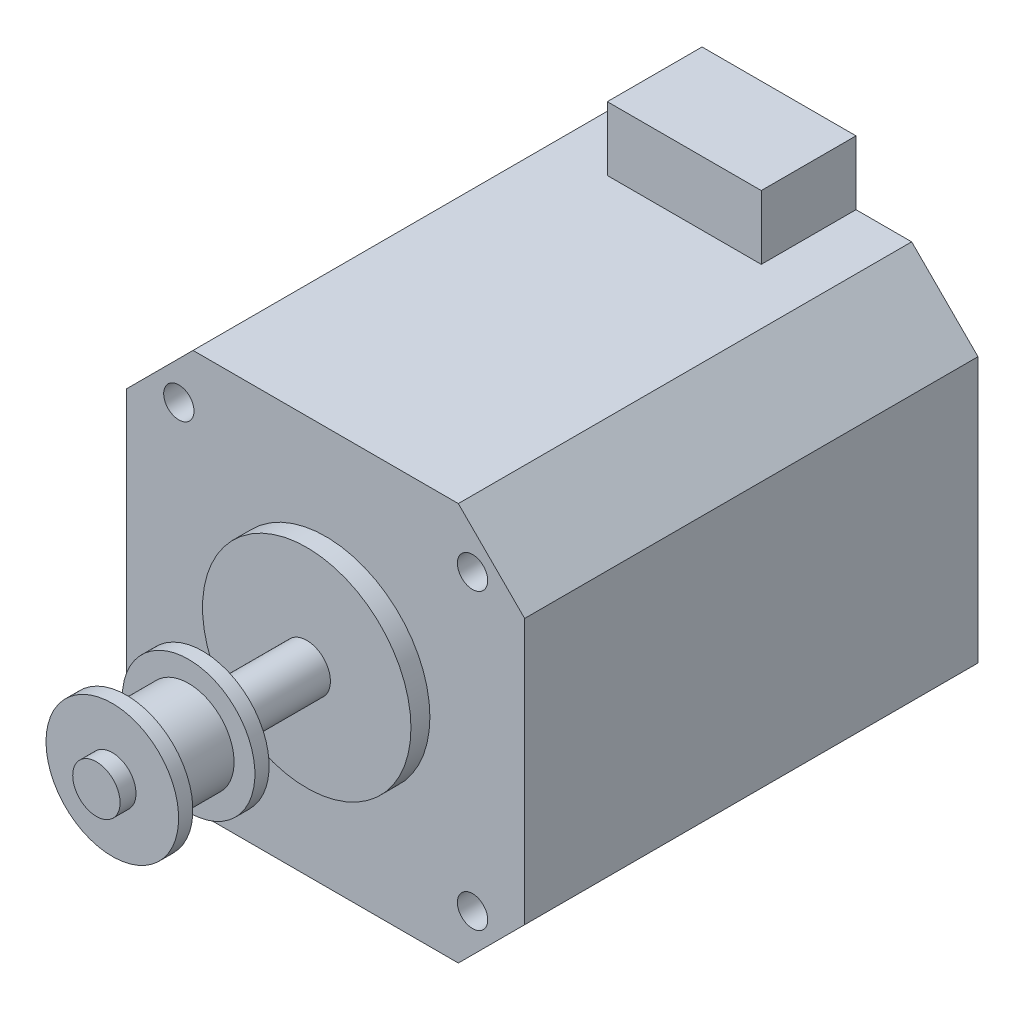
ISO-10303-21;
HEADER;
FILE_DESCRIPTION(('STEP AP214'),'2;1');
FILE_NAME('part.step','',(''),(''),'','','');
FILE_SCHEMA(('AUTOMOTIVE_DESIGN { 1 0 10303 214 1 1 1 1 }'));
ENDSEC;
DATA;
#1=APPLICATION_CONTEXT('core data for automotive mechanical design processes');
#2=APPLICATION_PROTOCOL_DEFINITION('international standard','automotive_design',2000,#1);
#3=PRODUCT_CONTEXT('',#1,'mechanical');
#4=PRODUCT('Part','Part','',(#3));
#5=PRODUCT_RELATED_PRODUCT_CATEGORY('part','',(#4));
#6=PRODUCT_DEFINITION_FORMATION('','',#4);
#7=PRODUCT_DEFINITION_CONTEXT('part definition',#1,'design');
#8=PRODUCT_DEFINITION('design','',#6,#7);
#9=PRODUCT_DEFINITION_SHAPE('','',#8);
#10=(LENGTH_UNIT() NAMED_UNIT(*) SI_UNIT(.MILLI.,.METRE.));
#11=(NAMED_UNIT(*) PLANE_ANGLE_UNIT() SI_UNIT($,.RADIAN.));
#12=(NAMED_UNIT(*) SI_UNIT($,.STERADIAN.) SOLID_ANGLE_UNIT());
#13=UNCERTAINTY_MEASURE_WITH_UNIT(LENGTH_MEASURE(1.E-05),#10,'distance_accuracy_value','');
#14=(GEOMETRIC_REPRESENTATION_CONTEXT(3) GLOBAL_UNCERTAINTY_ASSIGNED_CONTEXT((#13)) GLOBAL_UNIT_ASSIGNED_CONTEXT((#10,
#11,#12)) REPRESENTATION_CONTEXT('',''));
#15=CARTESIAN_POINT('',(0.,0.,0.));
#16=DIRECTION('',(0.,0.,1.));
#17=DIRECTION('',(1.,0.,0.));
#18=AXIS2_PLACEMENT_3D('',#15,#16,#17);
#19=CARTESIAN_POINT('',(0.,42.,47.85));
#20=DIRECTION('',(0.,-1.,0.));
#21=DIRECTION('',(0.,0.,-1.));
#22=AXIS2_PLACEMENT_3D('',#19,#20,#21);
#23=PLANE('',#22);
#24=DIRECTION('',(0.,0.,-1.));
#25=VECTOR('',#24,1.);
#26=CARTESIAN_POINT('',(29.125,42.,10.));
#27=LINE('',#26,#25);
#28=CARTESIAN_POINT('',(29.125,42.,10.));
#29=VERTEX_POINT('',#28);
#30=CARTESIAN_POINT('',(29.125,42.,0.));
#31=VERTEX_POINT('',#30);
#32=EDGE_CURVE('E146',#29,#31,#27,.T.);
#33=ORIENTED_EDGE('',*,*,#32,.F.);
#34=DIRECTION('',(-1.,0.,0.));
#35=VECTOR('',#34,1.);
#36=CARTESIAN_POINT('',(29.125,42.,10.));
#37=LINE('',#36,#35);
#38=CARTESIAN_POINT('',(12.875,42.,10.));
#39=VERTEX_POINT('',#38);
#40=EDGE_CURVE('E133',#29,#39,#37,.T.);
#41=ORIENTED_EDGE('',*,*,#40,.T.);
#42=DIRECTION('',(0.,0.,-1.));
#43=VECTOR('',#42,1.);
#44=CARTESIAN_POINT('',(12.875,42.,10.));
#45=LINE('',#44,#43);
#46=CARTESIAN_POINT('',(12.875,42.,0.));
#47=VERTEX_POINT('',#46);
#48=EDGE_CURVE('E155',#39,#47,#45,.T.);
#49=ORIENTED_EDGE('',*,*,#48,.T.);
#50=DIRECTION('',(-1.,0.,0.));
#51=VECTOR('',#50,1.);
#52=CARTESIAN_POINT('',(0.,42.,0.));
#53=LINE('',#52,#51);
#54=CARTESIAN_POINT('',(7.00000000000003,42.,0.));
#55=VERTEX_POINT('',#54);
#56=EDGE_CURVE('E187',#47,#55,#53,.T.);
#57=ORIENTED_EDGE('',*,*,#56,.T.);
#58=DIRECTION('',(0.,0.,1.));
#59=VECTOR('',#58,1.);
#60=CARTESIAN_POINT('',(7.00000000000003,42.,47.85));
#61=LINE('',#60,#59);
#62=CARTESIAN_POINT('',(7.00000000000003,42.,47.85));
#63=VERTEX_POINT('',#62);
#64=EDGE_CURVE('E65',#55,#63,#61,.T.);
#65=ORIENTED_EDGE('',*,*,#64,.T.);
#66=DIRECTION('',(-1.,0.,0.));
#67=VECTOR('',#66,1.);
#68=CARTESIAN_POINT('',(0.,42.,47.85));
#69=LINE('',#68,#67);
#70=CARTESIAN_POINT('',(35.,42.,47.85));
#71=VERTEX_POINT('',#70);
#72=EDGE_CURVE('E176',#71,#63,#69,.T.);
#73=ORIENTED_EDGE('',*,*,#72,.F.);
#74=DIRECTION('',(0.,0.,-1.));
#75=VECTOR('',#74,1.);
#76=CARTESIAN_POINT('',(35.,42.,47.85));
#77=LINE('',#76,#75);
#78=CARTESIAN_POINT('',(35.,42.,0.));
#79=VERTEX_POINT('',#78);
#80=EDGE_CURVE('E45',#71,#79,#77,.T.);
#81=ORIENTED_EDGE('',*,*,#80,.T.);
#82=EDGE_CURVE('E154',#79,#31,#53,.T.);
#83=ORIENTED_EDGE('',*,*,#82,.T.);
#84=EDGE_LOOP('',(#33,#41,#49,#57,#65,#73,#81,#83));
#85=FACE_BOUND('',#84,.T.);
#86=ADVANCED_FACE('F40',(#85),#23,.F.);
#87=CARTESIAN_POINT('',(0.,0.,47.85));
#88=DIRECTION('',(1.,0.,0.));
#89=DIRECTION('',(0.,0.,-1.));
#90=AXIS2_PLACEMENT_3D('',#87,#88,#89);
#91=PLANE('',#90);
#92=DIRECTION('',(0.,-1.,0.));
#93=VECTOR('',#92,1.);
#94=CARTESIAN_POINT('',(0.,0.,0.));
#95=LINE('',#94,#93);
#96=CARTESIAN_POINT('',(0.,35.,0.));
#97=VERTEX_POINT('',#96);
#98=CARTESIAN_POINT('',(0.,7.00000000000002,0.));
#99=VERTEX_POINT('',#98);
#100=EDGE_CURVE('E165',#97,#99,#95,.T.);
#101=ORIENTED_EDGE('',*,*,#100,.T.);
#102=DIRECTION('',(0.,0.,1.));
#103=VECTOR('',#102,1.);
#104=CARTESIAN_POINT('',(0.,7.00000000000003,47.85));
#105=LINE('',#104,#103);
#106=CARTESIAN_POINT('',(0.,7.00000000000002,47.85));
#107=VERTEX_POINT('',#106);
#108=EDGE_CURVE('E205',#99,#107,#105,.T.);
#109=ORIENTED_EDGE('',*,*,#108,.T.);
#110=DIRECTION('',(0.,-1.,0.));
#111=VECTOR('',#110,1.);
#112=CARTESIAN_POINT('',(0.,0.,47.85));
#113=LINE('',#112,#111);
#114=CARTESIAN_POINT('',(0.,35.,47.85));
#115=VERTEX_POINT('',#114);
#116=EDGE_CURVE('E167',#115,#107,#113,.T.);
#117=ORIENTED_EDGE('',*,*,#116,.F.);
#118=DIRECTION('',(0.,0.,-1.));
#119=VECTOR('',#118,1.);
#120=CARTESIAN_POINT('',(0.,35.,47.85));
#121=LINE('',#120,#119);
#122=EDGE_CURVE('E202',#115,#97,#121,.T.);
#123=ORIENTED_EDGE('',*,*,#122,.T.);
#124=EDGE_LOOP('',(#101,#109,#117,#123));
#125=FACE_BOUND('',#124,.T.);
#126=ADVANCED_FACE('F253',(#125),#91,.F.);
#127=CARTESIAN_POINT('',(0.,0.,47.85));
#128=DIRECTION('',(0.,1.,0.));
#129=DIRECTION('',(0.,0.,1.));
#130=AXIS2_PLACEMENT_3D('',#127,#128,#129);
#131=PLANE('',#130);
#132=DIRECTION('',(1.,0.,0.));
#133=VECTOR('',#132,1.);
#134=CARTESIAN_POINT('',(0.,0.,47.85));
#135=LINE('',#134,#133);
#136=CARTESIAN_POINT('',(7.,0.,47.85));
#137=VERTEX_POINT('',#136);
#138=CARTESIAN_POINT('',(35.,0.,47.85));
#139=VERTEX_POINT('',#138);
#140=EDGE_CURVE('E170',#137,#139,#135,.T.);
#141=ORIENTED_EDGE('',*,*,#140,.F.);
#142=DIRECTION('',(0.,0.,-1.));
#143=VECTOR('',#142,1.);
#144=CARTESIAN_POINT('',(7.,0.,47.85));
#145=LINE('',#144,#143);
#146=CARTESIAN_POINT('',(7.,0.,0.));
#147=VERTEX_POINT('',#146);
#148=EDGE_CURVE('E190',#137,#147,#145,.T.);
#149=ORIENTED_EDGE('',*,*,#148,.T.);
#150=DIRECTION('',(1.,0.,0.));
#151=VECTOR('',#150,1.);
#152=CARTESIAN_POINT('',(0.,0.,0.));
#153=LINE('',#152,#151);
#154=CARTESIAN_POINT('',(35.,0.,0.));
#155=VERTEX_POINT('',#154);
#156=EDGE_CURVE('E181',#147,#155,#153,.T.);
#157=ORIENTED_EDGE('',*,*,#156,.T.);
#158=DIRECTION('',(0.,0.,1.));
#159=VECTOR('',#158,1.);
#160=CARTESIAN_POINT('',(35.,0.,47.85));
#161=LINE('',#160,#159);
#162=EDGE_CURVE('E178',#155,#139,#161,.T.);
#163=ORIENTED_EDGE('',*,*,#162,.T.);
#164=EDGE_LOOP('',(#141,#149,#157,#163));
#165=FACE_BOUND('',#164,.T.);
#166=ADVANCED_FACE('F258',(#165),#131,.F.);
#167=CARTESIAN_POINT('',(42.,0.,47.85));
#168=DIRECTION('',(-1.,0.,0.));
#169=DIRECTION('',(0.,0.,1.));
#170=AXIS2_PLACEMENT_3D('',#167,#168,#169);
#171=PLANE('',#170);
#172=DIRECTION('',(0.,1.,0.));
#173=VECTOR('',#172,1.);
#174=CARTESIAN_POINT('',(42.,0.,47.85));
#175=LINE('',#174,#173);
#176=CARTESIAN_POINT('',(42.,7.,47.85));
#177=VERTEX_POINT('',#176);
#178=CARTESIAN_POINT('',(42.,35.,47.85));
#179=VERTEX_POINT('',#178);
#180=EDGE_CURVE('E173',#177,#179,#175,.T.);
#181=ORIENTED_EDGE('',*,*,#180,.F.);
#182=DIRECTION('',(0.,0.,-1.));
#183=VECTOR('',#182,1.);
#184=CARTESIAN_POINT('',(42.,7.,47.85));
#185=LINE('',#184,#183);
#186=CARTESIAN_POINT('',(42.,7.,0.));
#187=VERTEX_POINT('',#186);
#188=EDGE_CURVE('E217',#177,#187,#185,.T.);
#189=ORIENTED_EDGE('',*,*,#188,.T.);
#190=DIRECTION('',(0.,1.,0.));
#191=VECTOR('',#190,1.);
#192=CARTESIAN_POINT('',(42.,0.,0.));
#193=LINE('',#192,#191);
#194=CARTESIAN_POINT('',(42.,35.,0.));
#195=VERTEX_POINT('',#194);
#196=EDGE_CURVE('E184',#187,#195,#193,.T.);
#197=ORIENTED_EDGE('',*,*,#196,.T.);
#198=DIRECTION('',(0.,0.,1.));
#199=VECTOR('',#198,1.);
#200=CARTESIAN_POINT('',(42.,35.,47.85));
#201=LINE('',#200,#199);
#202=EDGE_CURVE('E215',#195,#179,#201,.T.);
#203=ORIENTED_EDGE('',*,*,#202,.T.);
#204=EDGE_LOOP('',(#181,#189,#197,#203));
#205=FACE_BOUND('',#204,.T.);
#206=ADVANCED_FACE('F264',(#205),#171,.F.);
#207=CARTESIAN_POINT('',(0.,0.,47.85));
#208=DIRECTION('',(0.,0.,-1.));
#209=DIRECTION('',(-1.,0.,0.));
#210=AXIS2_PLACEMENT_3D('',#207,#208,#209);
#211=PLANE('',#210);
#212=CARTESIAN_POINT('',(5.49999999999998,5.50000000000001,47.85));
#213=DIRECTION('',(0.,0.,1.));
#214=DIRECTION('',(1.,0.,0.));
#215=AXIS2_PLACEMENT_3D('',#212,#213,#214);
#216=CIRCLE('',#215,1.6);
#217=CARTESIAN_POINT('',(7.09999999999998,5.50000000000001,47.85));
#218=VERTEX_POINT('',#217);
#219=EDGE_CURVE('E358',#218,#218,#216,.T.);
#220=ORIENTED_EDGE('',*,*,#219,.F.);
#221=EDGE_LOOP('',(#220));
#222=FACE_BOUND('',#221,.T.);
#223=CARTESIAN_POINT('',(36.5,5.50000000000001,47.85));
#224=DIRECTION('',(0.,0.,1.));
#225=DIRECTION('',(1.,0.,0.));
#226=AXIS2_PLACEMENT_3D('',#223,#224,#225);
#227=CIRCLE('',#226,1.6);
#228=CARTESIAN_POINT('',(38.1,5.50000000000001,47.85));
#229=VERTEX_POINT('',#228);
#230=EDGE_CURVE('E352',#229,#229,#227,.T.);
#231=ORIENTED_EDGE('',*,*,#230,.F.);
#232=EDGE_LOOP('',(#231));
#233=FACE_BOUND('',#232,.T.);
#234=CARTESIAN_POINT('',(36.5,36.5,47.85));
#235=DIRECTION('',(0.,0.,1.));
#236=DIRECTION('',(1.,0.,0.));
#237=AXIS2_PLACEMENT_3D('',#234,#235,#236);
#238=CIRCLE('',#237,1.6);
#239=CARTESIAN_POINT('',(38.1,36.5,47.85));
#240=VERTEX_POINT('',#239);
#241=EDGE_CURVE('E346',#240,#240,#238,.T.);
#242=ORIENTED_EDGE('',*,*,#241,.F.);
#243=EDGE_LOOP('',(#242));
#244=FACE_BOUND('',#243,.T.);
#245=CARTESIAN_POINT('',(5.49999999999998,36.5,47.85));
#246=DIRECTION('',(0.,0.,1.));
#247=DIRECTION('',(1.,0.,0.));
#248=AXIS2_PLACEMENT_3D('',#245,#246,#247);
#249=CIRCLE('',#248,1.6);
#250=CARTESIAN_POINT('',(7.09999999999998,36.5,47.85));
#251=VERTEX_POINT('',#250);
#252=EDGE_CURVE('E233',#251,#251,#249,.T.);
#253=ORIENTED_EDGE('',*,*,#252,.F.);
#254=EDGE_LOOP('',(#253));
#255=FACE_BOUND('',#254,.T.);
#256=CARTESIAN_POINT('',(21.,21.,47.85));
#257=DIRECTION('',(0.,0.,1.));
#258=DIRECTION('',(1.,0.,0.));
#259=AXIS2_PLACEMENT_3D('',#256,#257,#258);
#260=CIRCLE('',#259,11.);
#261=CARTESIAN_POINT('',(32.,21.,47.85));
#262=VERTEX_POINT('',#261);
#263=EDGE_CURVE('E11',#262,#262,#260,.T.);
#264=ORIENTED_EDGE('',*,*,#263,.F.);
#265=EDGE_LOOP('',(#264));
#266=FACE_BOUND('',#265,.T.);
#267=ORIENTED_EDGE('',*,*,#116,.T.);
#268=DIRECTION('',(-0.707106781186546,0.707106781186549,0.));
#269=VECTOR('',#268,1.);
#270=CARTESIAN_POINT('',(7.,0.,47.85));
#271=LINE('',#270,#269);
#272=EDGE_CURVE('E213',#107,#137,#271,.F.);
#273=ORIENTED_EDGE('',*,*,#272,.T.);
#274=ORIENTED_EDGE('',*,*,#140,.T.);
#275=DIRECTION('',(-0.707106781186549,-0.707106781186546,0.));
#276=VECTOR('',#275,1.);
#277=CARTESIAN_POINT('',(42.,7.,47.85));
#278=LINE('',#277,#276);
#279=EDGE_CURVE('E211',#139,#177,#278,.F.);
#280=ORIENTED_EDGE('',*,*,#279,.T.);
#281=ORIENTED_EDGE('',*,*,#180,.T.);
#282=DIRECTION('',(0.707106781186546,-0.707106781186549,0.));
#283=VECTOR('',#282,1.);
#284=CARTESIAN_POINT('',(35.,42.,47.85));
#285=LINE('',#284,#283);
#286=EDGE_CURVE('E209',#179,#71,#285,.F.);
#287=ORIENTED_EDGE('',*,*,#286,.T.);
#288=ORIENTED_EDGE('',*,*,#72,.T.);
#289=DIRECTION('',(0.707106781186549,0.707106781186546,0.));
#290=VECTOR('',#289,1.);
#291=CARTESIAN_POINT('',(0.,35.,47.85));
#292=LINE('',#291,#290);
#293=EDGE_CURVE('E207',#63,#115,#292,.F.);
#294=ORIENTED_EDGE('',*,*,#293,.T.);
#295=EDGE_LOOP('',(#267,#273,#274,#280,#281,#287,#288,#294));
#296=FACE_BOUND('',#295,.T.);
#297=ADVANCED_FACE('F267',(#222,#233,#244,#255,#266,#296),#211,.F.);
#298=CARTESIAN_POINT('',(0.,0.,0.));
#299=DIRECTION('',(0.,0.,-1.));
#300=DIRECTION('',(-1.,0.,0.));
#301=AXIS2_PLACEMENT_3D('',#298,#299,#300);
#302=PLANE('',#301);
#303=ORIENTED_EDGE('',*,*,#156,.F.);
#304=DIRECTION('',(0.707106781186546,-0.707106781186549,0.));
#305=VECTOR('',#304,1.);
#306=CARTESIAN_POINT('',(3.50000000000001,3.5,0.));
#307=LINE('',#306,#305);
#308=EDGE_CURVE('E200',#147,#99,#307,.F.);
#309=ORIENTED_EDGE('',*,*,#308,.T.);
#310=ORIENTED_EDGE('',*,*,#100,.F.);
#311=DIRECTION('',(-0.707106781186549,-0.707106781186546,0.));
#312=VECTOR('',#311,1.);
#313=CARTESIAN_POINT('',(-17.5,17.5000000000001,0.));
#314=LINE('',#313,#312);
#315=EDGE_CURVE('E193',#97,#55,#314,.F.);
#316=ORIENTED_EDGE('',*,*,#315,.T.);
#317=ORIENTED_EDGE('',*,*,#56,.F.);
#318=DIRECTION('',(0.,1.,0.));
#319=VECTOR('',#318,1.);
#320=CARTESIAN_POINT('',(12.875,42.,0.));
#321=LINE('',#320,#319);
#322=CARTESIAN_POINT('',(12.875,48.75,0.));
#323=VERTEX_POINT('',#322);
#324=EDGE_CURVE('E57',#47,#323,#321,.T.);
#325=ORIENTED_EDGE('',*,*,#324,.T.);
#326=DIRECTION('',(1.,0.,0.));
#327=VECTOR('',#326,1.);
#328=CARTESIAN_POINT('',(29.125,48.75,0.));
#329=LINE('',#328,#327);
#330=CARTESIAN_POINT('',(29.125,48.75,0.));
#331=VERTEX_POINT('',#330);
#332=EDGE_CURVE('E149',#323,#331,#329,.T.);
#333=ORIENTED_EDGE('',*,*,#332,.T.);
#334=DIRECTION('',(0.,-1.,0.));
#335=VECTOR('',#334,1.);
#336=CARTESIAN_POINT('',(29.125,42.,0.));
#337=LINE('',#336,#335);
#338=EDGE_CURVE('E227',#331,#31,#337,.T.);
#339=ORIENTED_EDGE('',*,*,#338,.T.);
#340=ORIENTED_EDGE('',*,*,#82,.F.);
#341=DIRECTION('',(-0.707106781186546,0.707106781186549,0.));
#342=VECTOR('',#341,1.);
#343=CARTESIAN_POINT('',(38.5000000000001,38.4999999999999,0.));
#344=LINE('',#343,#342);
#345=EDGE_CURVE('E196',#79,#195,#344,.F.);
#346=ORIENTED_EDGE('',*,*,#345,.T.);
#347=ORIENTED_EDGE('',*,*,#196,.F.);
#348=DIRECTION('',(0.707106781186549,0.707106781186546,0.));
#349=VECTOR('',#348,1.);
#350=CARTESIAN_POINT('',(17.4999999999999,-17.5,0.));
#351=LINE('',#350,#349);
#352=EDGE_CURVE('E198',#187,#155,#351,.F.);
#353=ORIENTED_EDGE('',*,*,#352,.T.);
#354=EDGE_LOOP('',(#303,#309,#310,#316,#317,#325,#333,#339,#340,#346,#347,#353));
#355=FACE_BOUND('',#354,.T.);
#356=ADVANCED_FACE('F224',(#355),#302,.T.);
#357=CARTESIAN_POINT('',(7.,0.,47.85));
#358=DIRECTION('',(0.707106781186549,0.707106781186546,0.));
#359=DIRECTION('',(0.,0.,-1.));
#360=AXIS2_PLACEMENT_3D('',#357,#358,#359);
#361=PLANE('',#360);
#362=ORIENTED_EDGE('',*,*,#272,.F.);
#363=ORIENTED_EDGE('',*,*,#108,.F.);
#364=ORIENTED_EDGE('',*,*,#308,.F.);
#365=ORIENTED_EDGE('',*,*,#148,.F.);
#366=EDGE_LOOP('',(#362,#363,#364,#365));
#367=FACE_BOUND('',#366,.T.);
#368=ADVANCED_FACE('F273',(#367),#361,.F.);
#369=CARTESIAN_POINT('',(42.,7.,47.85));
#370=DIRECTION('',(-0.707106781186546,0.707106781186549,0.));
#371=DIRECTION('',(0.,0.,-1.));
#372=AXIS2_PLACEMENT_3D('',#369,#370,#371);
#373=PLANE('',#372);
#374=ORIENTED_EDGE('',*,*,#279,.F.);
#375=ORIENTED_EDGE('',*,*,#162,.F.);
#376=ORIENTED_EDGE('',*,*,#352,.F.);
#377=ORIENTED_EDGE('',*,*,#188,.F.);
#378=EDGE_LOOP('',(#374,#375,#376,#377));
#379=FACE_BOUND('',#378,.T.);
#380=ADVANCED_FACE('F279',(#379),#373,.F.);
#381=CARTESIAN_POINT('',(35.,42.,47.85));
#382=DIRECTION('',(-0.707106781186549,-0.707106781186546,0.));
#383=DIRECTION('',(0.,0.,-1.));
#384=AXIS2_PLACEMENT_3D('',#381,#382,#383);
#385=PLANE('',#384);
#386=ORIENTED_EDGE('',*,*,#286,.F.);
#387=ORIENTED_EDGE('',*,*,#202,.F.);
#388=ORIENTED_EDGE('',*,*,#345,.F.);
#389=ORIENTED_EDGE('',*,*,#80,.F.);
#390=EDGE_LOOP('',(#386,#387,#388,#389));
#391=FACE_BOUND('',#390,.T.);
#392=ADVANCED_FACE('F285',(#391),#385,.F.);
#393=CARTESIAN_POINT('',(0.,35.,47.85));
#394=DIRECTION('',(0.707106781186546,-0.707106781186549,0.));
#395=DIRECTION('',(0.,0.,-1.));
#396=AXIS2_PLACEMENT_3D('',#393,#394,#395);
#397=PLANE('',#396);
#398=ORIENTED_EDGE('',*,*,#293,.F.);
#399=ORIENTED_EDGE('',*,*,#64,.F.);
#400=ORIENTED_EDGE('',*,*,#315,.F.);
#401=ORIENTED_EDGE('',*,*,#122,.F.);
#402=EDGE_LOOP('',(#398,#399,#400,#401));
#403=FACE_BOUND('',#402,.T.);
#404=ADVANCED_FACE('F43',(#403),#397,.F.);
#405=CARTESIAN_POINT('',(21.,21.,49.85));
#406=DIRECTION('',(0.,0.,-1.));
#407=DIRECTION('',(-1.,0.,0.));
#408=AXIS2_PLACEMENT_3D('',#405,#406,#407);
#409=CYLINDRICAL_SURFACE('',#408,11.);
#410=CARTESIAN_POINT('',(21.,21.,49.85));
#411=DIRECTION('',(0.,0.,1.));
#412=DIRECTION('',(1.,0.,0.));
#413=AXIS2_PLACEMENT_3D('',#410,#411,#412);
#414=CIRCLE('',#413,11.);
#415=CARTESIAN_POINT('',(32.,21.,49.85));
#416=VERTEX_POINT('',#415);
#417=EDGE_CURVE('E163',#416,#416,#414,.T.);
#418=ORIENTED_EDGE('',*,*,#417,.F.);
#419=EDGE_LOOP('',(#418));
#420=FACE_BOUND('',#419,.T.);
#421=ORIENTED_EDGE('',*,*,#263,.T.);
#422=EDGE_LOOP('',(#421));
#423=FACE_BOUND('',#422,.T.);
#424=ADVANCED_FACE('F293',(#420,#423),#409,.T.);
#425=CARTESIAN_POINT('',(21.,21.,49.85));
#426=DIRECTION('',(0.,0.,1.));
#427=DIRECTION('',(1.,0.,0.));
#428=AXIS2_PLACEMENT_3D('',#425,#426,#427);
#429=PLANE('',#428);
#430=CARTESIAN_POINT('',(21.,21.,49.85));
#431=DIRECTION('',(0.,0.,-1.));
#432=DIRECTION('',(-1.,0.,0.));
#433=AXIS2_PLACEMENT_3D('',#430,#431,#432);
#434=CIRCLE('',#433,2.5);
#435=CARTESIAN_POINT('',(18.5,21.,49.85));
#436=VERTEX_POINT('',#435);
#437=EDGE_CURVE('E327',#436,#436,#434,.T.);
#438=ORIENTED_EDGE('',*,*,#437,.T.);
#439=EDGE_LOOP('',(#438));
#440=FACE_BOUND('',#439,.T.);
#441=ORIENTED_EDGE('',*,*,#417,.T.);
#442=EDGE_LOOP('',(#441));
#443=FACE_BOUND('',#442,.T.);
#444=ADVANCED_FACE('F249',(#440,#443),#429,.T.);
#445=CARTESIAN_POINT('',(29.125,42.,10.));
#446=DIRECTION('',(1.,0.,0.));
#447=DIRECTION('',(0.,0.,-1.));
#448=AXIS2_PLACEMENT_3D('',#445,#446,#447);
#449=PLANE('',#448);
#450=ORIENTED_EDGE('',*,*,#338,.F.);
#451=DIRECTION('',(0.,0.,-1.));
#452=VECTOR('',#451,1.);
#453=CARTESIAN_POINT('',(29.125,48.75,10.));
#454=LINE('',#453,#452);
#455=CARTESIAN_POINT('',(29.125,48.75,10.));
#456=VERTEX_POINT('',#455);
#457=EDGE_CURVE('E148',#456,#331,#454,.T.);
#458=ORIENTED_EDGE('',*,*,#457,.F.);
#459=DIRECTION('',(0.,-1.,0.));
#460=VECTOR('',#459,1.);
#461=CARTESIAN_POINT('',(29.125,42.,10.));
#462=LINE('',#461,#460);
#463=EDGE_CURVE('E137',#456,#29,#462,.T.);
#464=ORIENTED_EDGE('',*,*,#463,.T.);
#465=ORIENTED_EDGE('',*,*,#32,.T.);
#466=EDGE_LOOP('',(#450,#458,#464,#465));
#467=FACE_BOUND('',#466,.T.);
#468=ADVANCED_FACE('F145',(#467),#449,.T.);
#469=CARTESIAN_POINT('',(29.125,48.75,10.));
#470=DIRECTION('',(0.,1.,0.));
#471=DIRECTION('',(0.,0.,1.));
#472=AXIS2_PLACEMENT_3D('',#469,#470,#471);
#473=PLANE('',#472);
#474=ORIENTED_EDGE('',*,*,#332,.F.);
#475=DIRECTION('',(0.,0.,-1.));
#476=VECTOR('',#475,1.);
#477=CARTESIAN_POINT('',(12.875,48.75,10.));
#478=LINE('',#477,#476);
#479=CARTESIAN_POINT('',(12.875,48.75,10.));
#480=VERTEX_POINT('',#479);
#481=EDGE_CURVE('E158',#480,#323,#478,.T.);
#482=ORIENTED_EDGE('',*,*,#481,.F.);
#483=DIRECTION('',(1.,0.,0.));
#484=VECTOR('',#483,1.);
#485=CARTESIAN_POINT('',(29.125,48.75,10.));
#486=LINE('',#485,#484);
#487=EDGE_CURVE('E156',#480,#456,#486,.T.);
#488=ORIENTED_EDGE('',*,*,#487,.T.);
#489=ORIENTED_EDGE('',*,*,#457,.T.);
#490=EDGE_LOOP('',(#474,#482,#488,#489));
#491=FACE_BOUND('',#490,.T.);
#492=ADVANCED_FACE('F241',(#491),#473,.T.);
#493=CARTESIAN_POINT('',(12.875,42.,10.));
#494=DIRECTION('',(-1.,0.,0.));
#495=DIRECTION('',(0.,0.,1.));
#496=AXIS2_PLACEMENT_3D('',#493,#494,#495);
#497=PLANE('',#496);
#498=ORIENTED_EDGE('',*,*,#324,.F.);
#499=ORIENTED_EDGE('',*,*,#48,.F.);
#500=DIRECTION('',(0.,1.,0.));
#501=VECTOR('',#500,1.);
#502=CARTESIAN_POINT('',(12.875,42.,10.));
#503=LINE('',#502,#501);
#504=EDGE_CURVE('E140',#39,#480,#503,.T.);
#505=ORIENTED_EDGE('',*,*,#504,.T.);
#506=ORIENTED_EDGE('',*,*,#481,.T.);
#507=EDGE_LOOP('',(#498,#499,#505,#506));
#508=FACE_BOUND('',#507,.T.);
#509=ADVANCED_FACE('F238',(#508),#497,.T.);
#510=CARTESIAN_POINT('',(0.,0.,10.));
#511=DIRECTION('',(0.,0.,1.));
#512=DIRECTION('',(1.,0.,0.));
#513=AXIS2_PLACEMENT_3D('',#510,#511,#512);
#514=PLANE('',#513);
#515=ORIENTED_EDGE('',*,*,#463,.F.);
#516=ORIENTED_EDGE('',*,*,#487,.F.);
#517=ORIENTED_EDGE('',*,*,#504,.F.);
#518=ORIENTED_EDGE('',*,*,#40,.F.);
#519=EDGE_LOOP('',(#515,#516,#517,#518));
#520=FACE_BOUND('',#519,.T.);
#521=ADVANCED_FACE('F135',(#520),#514,.T.);
#522=CARTESIAN_POINT('',(5.49999999999998,36.5,44.85));
#523=DIRECTION('',(0.,0.,1.));
#524=DIRECTION('',(1.,0.,0.));
#525=AXIS2_PLACEMENT_3D('',#522,#523,#524);
#526=CYLINDRICAL_SURFACE('',#525,1.6);
#527=CARTESIAN_POINT('',(5.49999999999998,36.5,44.85));
#528=DIRECTION('',(0.,0.,1.));
#529=DIRECTION('',(1.,0.,0.));
#530=AXIS2_PLACEMENT_3D('',#527,#528,#529);
#531=CIRCLE('',#530,1.6);
#532=CARTESIAN_POINT('',(7.09999999999998,36.5,44.85));
#533=VERTEX_POINT('',#532);
#534=EDGE_CURVE('E229',#533,#533,#531,.T.);
#535=ORIENTED_EDGE('',*,*,#534,.F.);
#536=EDGE_LOOP('',(#535));
#537=FACE_BOUND('',#536,.T.);
#538=ORIENTED_EDGE('',*,*,#252,.T.);
#539=EDGE_LOOP('',(#538));
#540=FACE_BOUND('',#539,.T.);
#541=ADVANCED_FACE('F365',(#537,#540),#526,.F.);
#542=CARTESIAN_POINT('',(5.49999999999998,36.5,44.85));
#543=DIRECTION('',(0.,0.,1.));
#544=DIRECTION('',(1.,0.,0.));
#545=AXIS2_PLACEMENT_3D('',#542,#543,#544);
#546=PLANE('',#545);
#547=ORIENTED_EDGE('',*,*,#534,.T.);
#548=EDGE_LOOP('',(#547));
#549=FACE_BOUND('',#548,.T.);
#550=ADVANCED_FACE('F368',(#549),#546,.T.);
#551=CARTESIAN_POINT('',(36.5,36.5,44.85));
#552=DIRECTION('',(0.,0.,1.));
#553=DIRECTION('',(1.,0.,0.));
#554=AXIS2_PLACEMENT_3D('',#551,#552,#553);
#555=CYLINDRICAL_SURFACE('',#554,1.6);
#556=CARTESIAN_POINT('',(36.5,36.5,44.85));
#557=DIRECTION('',(0.,0.,1.));
#558=DIRECTION('',(1.,0.,0.));
#559=AXIS2_PLACEMENT_3D('',#556,#557,#558);
#560=CIRCLE('',#559,1.6);
#561=CARTESIAN_POINT('',(38.1,36.5,44.85));
#562=VERTEX_POINT('',#561);
#563=EDGE_CURVE('E343',#562,#562,#560,.T.);
#564=ORIENTED_EDGE('',*,*,#563,.F.);
#565=EDGE_LOOP('',(#564));
#566=FACE_BOUND('',#565,.T.);
#567=ORIENTED_EDGE('',*,*,#241,.T.);
#568=EDGE_LOOP('',(#567));
#569=FACE_BOUND('',#568,.T.);
#570=ADVANCED_FACE('F375',(#566,#569),#555,.F.);
#571=CARTESIAN_POINT('',(36.5,36.5,44.85));
#572=DIRECTION('',(0.,0.,1.));
#573=DIRECTION('',(1.,0.,0.));
#574=AXIS2_PLACEMENT_3D('',#571,#572,#573);
#575=PLANE('',#574);
#576=ORIENTED_EDGE('',*,*,#563,.T.);
#577=EDGE_LOOP('',(#576));
#578=FACE_BOUND('',#577,.T.);
#579=ADVANCED_FACE('F393',(#578),#575,.T.);
#580=CARTESIAN_POINT('',(36.5,5.50000000000001,44.85));
#581=DIRECTION('',(0.,0.,1.));
#582=DIRECTION('',(1.,0.,0.));
#583=AXIS2_PLACEMENT_3D('',#580,#581,#582);
#584=CYLINDRICAL_SURFACE('',#583,1.6);
#585=CARTESIAN_POINT('',(36.5,5.50000000000001,44.85));
#586=DIRECTION('',(0.,0.,1.));
#587=DIRECTION('',(1.,0.,0.));
#588=AXIS2_PLACEMENT_3D('',#585,#586,#587);
#589=CIRCLE('',#588,1.6);
#590=CARTESIAN_POINT('',(38.1,5.50000000000001,44.85));
#591=VERTEX_POINT('',#590);
#592=EDGE_CURVE('E349',#591,#591,#589,.T.);
#593=ORIENTED_EDGE('',*,*,#592,.F.);
#594=EDGE_LOOP('',(#593));
#595=FACE_BOUND('',#594,.T.);
#596=ORIENTED_EDGE('',*,*,#230,.T.);
#597=EDGE_LOOP('',(#596));
#598=FACE_BOUND('',#597,.T.);
#599=ADVANCED_FACE('F390',(#595,#598),#584,.F.);
#600=CARTESIAN_POINT('',(36.5,5.50000000000001,44.85));
#601=DIRECTION('',(0.,0.,1.));
#602=DIRECTION('',(1.,0.,0.));
#603=AXIS2_PLACEMENT_3D('',#600,#601,#602);
#604=PLANE('',#603);
#605=ORIENTED_EDGE('',*,*,#592,.T.);
#606=EDGE_LOOP('',(#605));
#607=FACE_BOUND('',#606,.T.);
#608=ADVANCED_FACE('F384',(#607),#604,.T.);
#609=CARTESIAN_POINT('',(5.49999999999998,5.50000000000001,44.85));
#610=DIRECTION('',(0.,0.,1.));
#611=DIRECTION('',(1.,0.,0.));
#612=AXIS2_PLACEMENT_3D('',#609,#610,#611);
#613=CYLINDRICAL_SURFACE('',#612,1.6);
#614=CARTESIAN_POINT('',(5.49999999999998,5.50000000000001,44.85));
#615=DIRECTION('',(0.,0.,1.));
#616=DIRECTION('',(1.,0.,0.));
#617=AXIS2_PLACEMENT_3D('',#614,#615,#616);
#618=CIRCLE('',#617,1.6);
#619=CARTESIAN_POINT('',(7.09999999999998,5.50000000000001,44.85));
#620=VERTEX_POINT('',#619);
#621=EDGE_CURVE('E355',#620,#620,#618,.T.);
#622=ORIENTED_EDGE('',*,*,#621,.F.);
#623=EDGE_LOOP('',(#622));
#624=FACE_BOUND('',#623,.T.);
#625=ORIENTED_EDGE('',*,*,#219,.T.);
#626=EDGE_LOOP('',(#625));
#627=FACE_BOUND('',#626,.T.);
#628=ADVANCED_FACE('F380',(#624,#627),#613,.F.);
#629=CARTESIAN_POINT('',(5.49999999999998,5.50000000000001,44.85));
#630=DIRECTION('',(0.,0.,1.));
#631=DIRECTION('',(1.,0.,0.));
#632=AXIS2_PLACEMENT_3D('',#629,#630,#631);
#633=PLANE('',#632);
#634=ORIENTED_EDGE('',*,*,#621,.T.);
#635=EDGE_LOOP('',(#634));
#636=FACE_BOUND('',#635,.T.);
#637=ADVANCED_FACE('F383',(#636),#633,.T.);
#638=CARTESIAN_POINT('',(21.,21.,49.85));
#639=DIRECTION('',(0.,0.,-1.));
#640=DIRECTION('',(-1.,0.,0.));
#641=AXIS2_PLACEMENT_3D('',#638,#639,#640);
#642=CYLINDRICAL_SURFACE('',#641,4.8);
#643=CARTESIAN_POINT('',(21.,21.,62.32));
#644=DIRECTION('',(0.,0.,-1.));
#645=DIRECTION('',(-1.,0.,0.));
#646=AXIS2_PLACEMENT_3D('',#643,#644,#645);
#647=CIRCLE('',#646,4.8);
#648=CARTESIAN_POINT('',(16.2,21.,62.32));
#649=VERTEX_POINT('',#648);
#650=EDGE_CURVE('E444',#649,#649,#647,.T.);
#651=ORIENTED_EDGE('',*,*,#650,.F.);
#652=EDGE_LOOP('',(#651));
#653=FACE_BOUND('',#652,.T.);
#654=CARTESIAN_POINT('',(21.,21.,68.87));
#655=DIRECTION('',(0.,0.,-1.));
#656=DIRECTION('',(-1.,0.,0.));
#657=AXIS2_PLACEMENT_3D('',#654,#655,#656);
#658=CIRCLE('',#657,4.8);
#659=CARTESIAN_POINT('',(16.2,21.,68.87));
#660=VERTEX_POINT('',#659);
#661=EDGE_CURVE('E447',#660,#660,#658,.T.);
#662=ORIENTED_EDGE('',*,*,#661,.T.);
#663=EDGE_LOOP('',(#662));
#664=FACE_BOUND('',#663,.T.);
#665=ADVANCED_FACE('F388',(#653,#664),#642,.T.);
#666=CARTESIAN_POINT('',(0.,21.,68.87));
#667=DIRECTION('',(0.,0.,-1.));
#668=DIRECTION('',(-1.,0.,0.));
#669=AXIS2_PLACEMENT_3D('',#666,#667,#668);
#670=PLANE('',#669);
#671=CARTESIAN_POINT('',(21.,21.,68.87));
#672=DIRECTION('',(0.,0.,-1.));
#673=DIRECTION('',(-1.,0.,0.));
#674=AXIS2_PLACEMENT_3D('',#671,#672,#673);
#675=CIRCLE('',#674,7.);
#676=CARTESIAN_POINT('',(14.,21.,68.87));
#677=VERTEX_POINT('',#676);
#678=EDGE_CURVE('E452',#677,#677,#675,.T.);
#679=ORIENTED_EDGE('',*,*,#678,.T.);
#680=EDGE_LOOP('',(#679));
#681=FACE_BOUND('',#680,.T.);
#682=ORIENTED_EDGE('',*,*,#661,.F.);
#683=EDGE_LOOP('',(#682));
#684=FACE_BOUND('',#683,.T.);
#685=ADVANCED_FACE('F425',(#681,#684),#670,.T.);
#686=CARTESIAN_POINT('',(21.,21.,49.85));
#687=DIRECTION('',(0.,0.,-1.));
#688=DIRECTION('',(-1.,0.,0.));
#689=AXIS2_PLACEMENT_3D('',#686,#687,#688);
#690=CYLINDRICAL_SURFACE('',#689,7.);
#691=ORIENTED_EDGE('',*,*,#678,.F.);
#692=EDGE_LOOP('',(#691));
#693=FACE_BOUND('',#692,.T.);
#694=CARTESIAN_POINT('',(21.,21.,70.37));
#695=DIRECTION('',(0.,0.,-1.));
#696=DIRECTION('',(-1.,0.,0.));
#697=AXIS2_PLACEMENT_3D('',#694,#695,#696);
#698=CIRCLE('',#697,7.);
#699=CARTESIAN_POINT('',(14.,21.,70.37));
#700=VERTEX_POINT('',#699);
#701=EDGE_CURVE('E455',#700,#700,#698,.T.);
#702=ORIENTED_EDGE('',*,*,#701,.T.);
#703=EDGE_LOOP('',(#702));
#704=FACE_BOUND('',#703,.T.);
#705=ADVANCED_FACE('F421',(#693,#704),#690,.T.);
#706=CARTESIAN_POINT('',(0.,21.,70.37));
#707=DIRECTION('',(0.,0.,-1.));
#708=DIRECTION('',(-1.,0.,0.));
#709=AXIS2_PLACEMENT_3D('',#706,#707,#708);
#710=PLANE('',#709);
#711=ORIENTED_EDGE('',*,*,#701,.F.);
#712=EDGE_LOOP('',(#711));
#713=FACE_BOUND('',#712,.T.);
#714=CARTESIAN_POINT('',(21.,21.,70.37));
#715=DIRECTION('',(0.,0.,-1.));
#716=DIRECTION('',(-1.,0.,0.));
#717=AXIS2_PLACEMENT_3D('',#714,#715,#716);
#718=CIRCLE('',#717,2.5);
#719=CARTESIAN_POINT('',(18.5,21.,70.37));
#720=VERTEX_POINT('',#719);
#721=EDGE_CURVE('E458',#720,#720,#718,.T.);
#722=ORIENTED_EDGE('',*,*,#721,.T.);
#723=EDGE_LOOP('',(#722));
#724=FACE_BOUND('',#723,.T.);
#725=ADVANCED_FACE('F417',(#713,#724),#710,.F.);
#726=CARTESIAN_POINT('',(0.,21.,62.32));
#727=DIRECTION('',(0.,0.,-1.));
#728=DIRECTION('',(-1.,0.,0.));
#729=AXIS2_PLACEMENT_3D('',#726,#727,#728);
#730=PLANE('',#729);
#731=CARTESIAN_POINT('',(21.,21.,62.32));
#732=DIRECTION('',(0.,0.,-1.));
#733=DIRECTION('',(-1.,0.,0.));
#734=AXIS2_PLACEMENT_3D('',#731,#732,#733);
#735=CIRCLE('',#734,7.);
#736=CARTESIAN_POINT('',(14.,21.,62.32));
#737=VERTEX_POINT('',#736);
#738=EDGE_CURVE('E337',#737,#737,#735,.T.);
#739=ORIENTED_EDGE('',*,*,#738,.F.);
#740=EDGE_LOOP('',(#739));
#741=FACE_BOUND('',#740,.T.);
#742=ORIENTED_EDGE('',*,*,#650,.T.);
#743=EDGE_LOOP('',(#742));
#744=FACE_BOUND('',#743,.T.);
#745=ADVANCED_FACE('F420',(#741,#744),#730,.F.);
#746=CARTESIAN_POINT('',(21.,21.,49.85));
#747=DIRECTION('',(0.,0.,-1.));
#748=DIRECTION('',(-1.,0.,0.));
#749=AXIS2_PLACEMENT_3D('',#746,#747,#748);
#750=CYLINDRICAL_SURFACE('',#749,7.);
#751=CARTESIAN_POINT('',(21.,21.,60.82));
#752=DIRECTION('',(0.,0.,-1.));
#753=DIRECTION('',(-1.,0.,0.));
#754=AXIS2_PLACEMENT_3D('',#751,#752,#753);
#755=CIRCLE('',#754,7.);
#756=CARTESIAN_POINT('',(14.,21.,60.82));
#757=VERTEX_POINT('',#756);
#758=EDGE_CURVE('E333',#757,#757,#755,.T.);
#759=ORIENTED_EDGE('',*,*,#758,.F.);
#760=EDGE_LOOP('',(#759));
#761=FACE_BOUND('',#760,.T.);
#762=ORIENTED_EDGE('',*,*,#738,.T.);
#763=EDGE_LOOP('',(#762));
#764=FACE_BOUND('',#763,.T.);
#765=ADVANCED_FACE('F415',(#761,#764),#750,.T.);
#766=CARTESIAN_POINT('',(0.,21.,60.82));
#767=DIRECTION('',(0.,0.,1.));
#768=DIRECTION('',(1.,0.,0.));
#769=AXIS2_PLACEMENT_3D('',#766,#767,#768);
#770=PLANE('',#769);
#771=CARTESIAN_POINT('',(21.,21.,60.82));
#772=DIRECTION('',(0.,0.,-1.));
#773=DIRECTION('',(-1.,0.,0.));
#774=AXIS2_PLACEMENT_3D('',#771,#772,#773);
#775=CIRCLE('',#774,2.5);
#776=CARTESIAN_POINT('',(18.5,21.,60.82));
#777=VERTEX_POINT('',#776);
#778=EDGE_CURVE('E360',#777,#777,#775,.T.);
#779=ORIENTED_EDGE('',*,*,#778,.F.);
#780=EDGE_LOOP('',(#779));
#781=FACE_BOUND('',#780,.T.);
#782=ORIENTED_EDGE('',*,*,#758,.T.);
#783=EDGE_LOOP('',(#782));
#784=FACE_BOUND('',#783,.T.);
#785=ADVANCED_FACE('F411',(#781,#784),#770,.F.);
#786=CARTESIAN_POINT('',(18.5,21.,72.05));
#787=DIRECTION('',(0.,0.,1.));
#788=DIRECTION('',(1.,0.,0.));
#789=AXIS2_PLACEMENT_3D('',#786,#787,#788);
#790=PLANE('',#789);
#791=CARTESIAN_POINT('',(21.,21.,72.05));
#792=DIRECTION('',(0.,0.,-1.));
#793=DIRECTION('',(-1.,0.,0.));
#794=AXIS2_PLACEMENT_3D('',#791,#792,#793);
#795=CIRCLE('',#794,2.5);
#796=CARTESIAN_POINT('',(18.5,21.,72.05));
#797=VERTEX_POINT('',#796);
#798=EDGE_CURVE('E334',#797,#797,#795,.T.);
#799=ORIENTED_EDGE('',*,*,#798,.F.);
#800=EDGE_LOOP('',(#799));
#801=FACE_BOUND('',#800,.T.);
#802=ADVANCED_FACE('F408',(#801),#790,.T.);
#803=CARTESIAN_POINT('',(21.,21.,49.85));
#804=DIRECTION('',(0.,0.,-1.));
#805=DIRECTION('',(-1.,0.,0.));
#806=AXIS2_PLACEMENT_3D('',#803,#804,#805);
#807=CYLINDRICAL_SURFACE('',#806,2.5);
#808=ORIENTED_EDGE('',*,*,#798,.T.);
#809=EDGE_LOOP('',(#808));
#810=FACE_BOUND('',#809,.T.);
#811=ORIENTED_EDGE('',*,*,#721,.F.);
#812=EDGE_LOOP('',(#811));
#813=FACE_BOUND('',#812,.T.);
#814=ADVANCED_FACE('F407',(#810,#813),#807,.T.);
#815=ORIENTED_EDGE('',*,*,#437,.F.);
#816=EDGE_LOOP('',(#815));
#817=FACE_BOUND('',#816,.T.);
#818=ORIENTED_EDGE('',*,*,#778,.T.);
#819=EDGE_LOOP('',(#818));
#820=FACE_BOUND('',#819,.T.);
#821=ADVANCED_FACE('F404',(#817,#820),#807,.T.);
#822=CLOSED_SHELL('',(#86,#126,#166,#206,#297,#356,#368,#380,#392,#404,#424,#444,#468,#492,#509,
#521,#541,#550,#570,#579,#599,#608,#628,#637,#665,#685,#705,#725,#745,#765,#785,#802,#814,#821));
#823=MANIFOLD_SOLID_BREP('B2',#822);
#824=ADVANCED_BREP_SHAPE_REPRESENTATION('',(#18,#823),#14);
#825=SHAPE_DEFINITION_REPRESENTATION(#9,#824);
ENDSEC;
END-ISO-10303-21;
